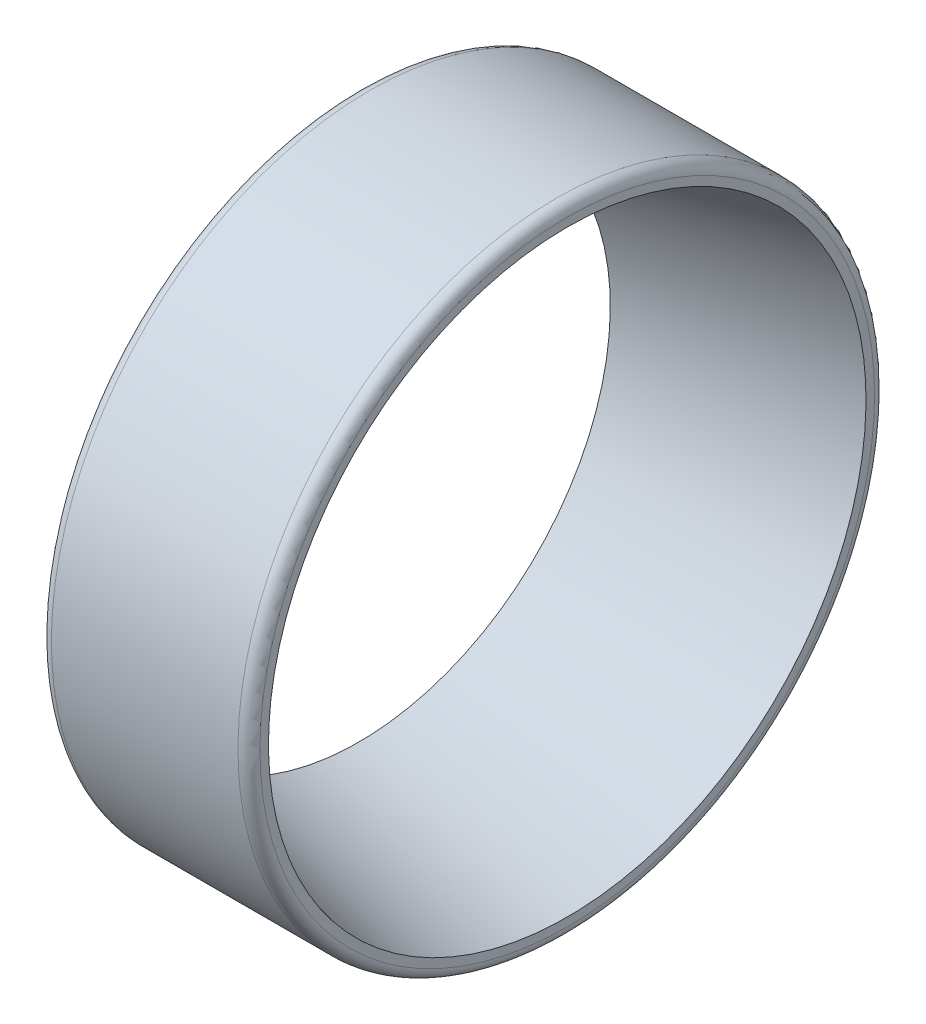
ISO-10303-21;
HEADER;
FILE_DESCRIPTION(('STEP AP214'),'2;1');
FILE_NAME('part.step','',(''),(''),'','','');
FILE_SCHEMA(('AUTOMOTIVE_DESIGN { 1 0 10303 214 1 1 1 1 }'));
ENDSEC;
DATA;
#1=APPLICATION_CONTEXT('core data for automotive mechanical design processes');
#2=APPLICATION_PROTOCOL_DEFINITION('international standard','automotive_design',2000,#1);
#3=PRODUCT_CONTEXT('',#1,'mechanical');
#4=PRODUCT('Part','Part','',(#3));
#5=PRODUCT_RELATED_PRODUCT_CATEGORY('part','',(#4));
#6=PRODUCT_DEFINITION_FORMATION('','',#4);
#7=PRODUCT_DEFINITION_CONTEXT('part definition',#1,'design');
#8=PRODUCT_DEFINITION('design','',#6,#7);
#9=PRODUCT_DEFINITION_SHAPE('','',#8);
#10=(LENGTH_UNIT() NAMED_UNIT(*) SI_UNIT(.MILLI.,.METRE.));
#11=(NAMED_UNIT(*) PLANE_ANGLE_UNIT() SI_UNIT($,.RADIAN.));
#12=(NAMED_UNIT(*) SI_UNIT($,.STERADIAN.) SOLID_ANGLE_UNIT());
#13=UNCERTAINTY_MEASURE_WITH_UNIT(LENGTH_MEASURE(1.E-05),#10,'distance_accuracy_value','');
#14=(GEOMETRIC_REPRESENTATION_CONTEXT(3) GLOBAL_UNCERTAINTY_ASSIGNED_CONTEXT((#13)) GLOBAL_UNIT_ASSIGNED_CONTEXT((#10,
#11,#12)) REPRESENTATION_CONTEXT('',''));
#15=CARTESIAN_POINT('',(0.,0.,0.));
#16=DIRECTION('',(0.,0.,1.));
#17=DIRECTION('',(1.,0.,0.));
#18=AXIS2_PLACEMENT_3D('',#15,#16,#17);
#19=CARTESIAN_POINT('',(18.,0.,0.));
#20=DIRECTION('',(1.,0.,0.));
#21=DIRECTION('',(0.,1.,0.));
#22=AXIS2_PLACEMENT_3D('',#19,#20,#21);
#23=TOROIDAL_SURFACE('',#22,28.,1.);
#24=CARTESIAN_POINT('',(19.,0.,0.));
#25=DIRECTION('',(1.,0.,0.));
#26=DIRECTION('',(0.,1.,0.));
#27=AXIS2_PLACEMENT_3D('',#24,#25,#26);
#28=CIRCLE('',#27,28.);
#29=CARTESIAN_POINT('',(19.,28.,0.));
#30=VERTEX_POINT('',#29);
#31=EDGE_CURVE('E68',#30,#30,#28,.T.);
#32=ORIENTED_EDGE('',*,*,#31,.F.);
#33=EDGE_LOOP('',(#32));
#34=FACE_BOUND('',#33,.T.);
#35=CARTESIAN_POINT('',(18.,0.,0.));
#36=DIRECTION('',(1.,0.,0.));
#37=DIRECTION('',(0.,1.,0.));
#38=AXIS2_PLACEMENT_3D('',#35,#36,#37);
#39=CIRCLE('',#38,29.);
#40=CARTESIAN_POINT('',(18.,29.,0.));
#41=VERTEX_POINT('',#40);
#42=EDGE_CURVE('E25',#41,#41,#39,.T.);
#43=ORIENTED_EDGE('',*,*,#42,.T.);
#44=EDGE_LOOP('',(#43));
#45=FACE_BOUND('',#44,.T.);
#46=ADVANCED_FACE('F16',(#34,#45),#23,.T.);
#47=CARTESIAN_POINT('',(1.,0.,0.));
#48=DIRECTION('',(1.,0.,0.));
#49=DIRECTION('',(0.,1.,0.));
#50=AXIS2_PLACEMENT_3D('',#47,#48,#49);
#51=TOROIDAL_SURFACE('',#50,28.,1.);
#52=CARTESIAN_POINT('',(1.,0.,0.));
#53=DIRECTION('',(1.,0.,0.));
#54=DIRECTION('',(0.,1.,0.));
#55=AXIS2_PLACEMENT_3D('',#52,#53,#54);
#56=CIRCLE('',#55,29.);
#57=CARTESIAN_POINT('',(1.,29.,0.));
#58=VERTEX_POINT('',#57);
#59=EDGE_CURVE('E73',#58,#58,#56,.T.);
#60=ORIENTED_EDGE('',*,*,#59,.F.);
#61=EDGE_LOOP('',(#60));
#62=FACE_BOUND('',#61,.T.);
#63=CARTESIAN_POINT('',(0.,0.,0.));
#64=DIRECTION('',(1.,0.,0.));
#65=DIRECTION('',(0.,1.,0.));
#66=AXIS2_PLACEMENT_3D('',#63,#64,#65);
#67=CIRCLE('',#66,28.);
#68=CARTESIAN_POINT('',(0.,28.,0.));
#69=VERTEX_POINT('',#68);
#70=EDGE_CURVE('E10',#69,#69,#67,.T.);
#71=ORIENTED_EDGE('',*,*,#70,.T.);
#72=EDGE_LOOP('',(#71));
#73=FACE_BOUND('',#72,.T.);
#74=ADVANCED_FACE('F18',(#62,#73),#51,.T.);
#75=CARTESIAN_POINT('',(0.,0.,0.));
#76=DIRECTION('',(-1.,0.,0.));
#77=DIRECTION('',(0.,0.,1.));
#78=AXIS2_PLACEMENT_3D('',#75,#76,#77);
#79=PLANE('',#78);
#80=CARTESIAN_POINT('',(0.,0.,0.));
#81=DIRECTION('',(1.,0.,0.));
#82=DIRECTION('',(0.,1.,0.));
#83=AXIS2_PLACEMENT_3D('',#80,#81,#82);
#84=CIRCLE('',#83,22.923);
#85=CARTESIAN_POINT('',(0.,22.923,0.));
#86=VERTEX_POINT('',#85);
#87=EDGE_CURVE('E58',#86,#86,#84,.T.);
#88=ORIENTED_EDGE('',*,*,#87,.T.);
#89=EDGE_LOOP('',(#88));
#90=FACE_BOUND('',#89,.T.);
#91=ORIENTED_EDGE('',*,*,#70,.F.);
#92=EDGE_LOOP('',(#91));
#93=FACE_BOUND('',#92,.T.);
#94=ADVANCED_FACE('F59',(#90,#93),#79,.T.);
#95=CARTESIAN_POINT('',(0.,0.,0.));
#96=DIRECTION('',(1.,0.,0.));
#97=DIRECTION('',(0.,1.,0.));
#98=AXIS2_PLACEMENT_3D('',#95,#96,#97);
#99=CYLINDRICAL_SURFACE('',#98,29.);
#100=ORIENTED_EDGE('',*,*,#42,.F.);
#101=EDGE_LOOP('',(#100));
#102=FACE_BOUND('',#101,.T.);
#103=ORIENTED_EDGE('',*,*,#59,.T.);
#104=EDGE_LOOP('',(#103));
#105=FACE_BOUND('',#104,.T.);
#106=ADVANCED_FACE('F110',(#102,#105),#99,.T.);
#107=CARTESIAN_POINT('',(19.,0.,0.));
#108=DIRECTION('',(1.,0.,0.));
#109=DIRECTION('',(0.,1.,0.));
#110=AXIS2_PLACEMENT_3D('',#107,#108,#109);
#111=PLANE('',#110);
#112=CARTESIAN_POINT('',(19.,0.,0.));
#113=DIRECTION('',(1.,0.,0.));
#114=DIRECTION('',(0.,1.,0.));
#115=AXIS2_PLACEMENT_3D('',#112,#113,#114);
#116=CIRCLE('',#115,27.2222610668435);
#117=CARTESIAN_POINT('',(19.,27.2222610668435,0.));
#118=VERTEX_POINT('',#117);
#119=EDGE_CURVE('E63',#118,#118,#116,.T.);
#120=ORIENTED_EDGE('',*,*,#119,.F.);
#121=EDGE_LOOP('',(#120));
#122=FACE_BOUND('',#121,.T.);
#123=ORIENTED_EDGE('',*,*,#31,.T.);
#124=EDGE_LOOP('',(#123));
#125=FACE_BOUND('',#124,.T.);
#126=ADVANCED_FACE('F98',(#122,#125),#111,.T.);
#127=CARTESIAN_POINT('',(9.5,0.,0.));
#128=DIRECTION('',(1.,0.,0.));
#129=DIRECTION('',(0.,1.,0.));
#130=AXIS2_PLACEMENT_3D('',#127,#128,#129);
#131=CONICAL_SURFACE('',#130,25.0726305334217,0.222529479629201);
#132=ORIENTED_EDGE('',*,*,#119,.T.);
#133=EDGE_LOOP('',(#132));
#134=FACE_BOUND('',#133,.T.);
#135=ORIENTED_EDGE('',*,*,#87,.F.);
#136=EDGE_LOOP('',(#135));
#137=FACE_BOUND('',#136,.T.);
#138=ADVANCED_FACE('F93',(#134,#137),#131,.F.);
#139=CLOSED_SHELL('',(#46,#74,#94,#106,#126,#138));
#140=MANIFOLD_SOLID_BREP('B1',#139);
#141=ADVANCED_BREP_SHAPE_REPRESENTATION('',(#18,#140),#14);
#142=SHAPE_DEFINITION_REPRESENTATION(#9,#141);
ENDSEC;
END-ISO-10303-21;
